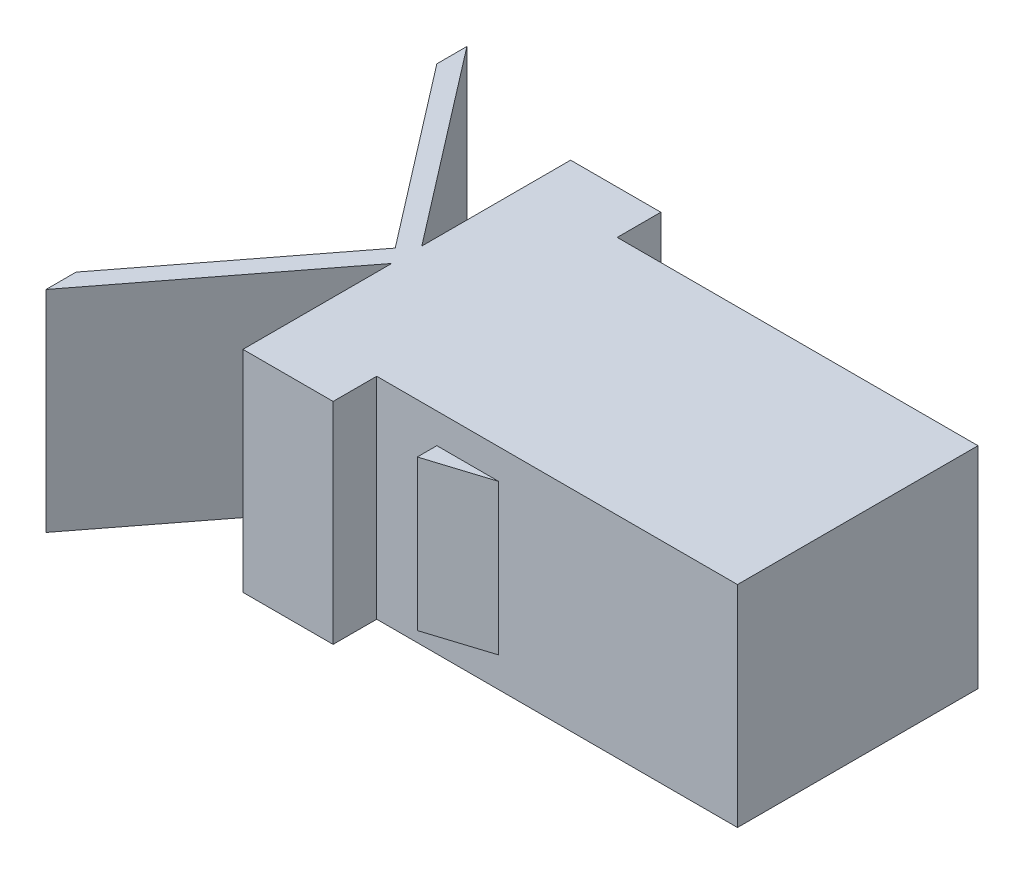
ISO-10303-21;
HEADER;
FILE_DESCRIPTION(('STEP AP214'),'2;1');
FILE_NAME('part.step','',(''),(''),'','','');
FILE_SCHEMA(('AUTOMOTIVE_DESIGN { 1 0 10303 214 1 1 1 1 }'));
ENDSEC;
DATA;
#1=APPLICATION_CONTEXT('core data for automotive mechanical design processes');
#2=APPLICATION_PROTOCOL_DEFINITION('international standard','automotive_design',2000,#1);
#3=PRODUCT_CONTEXT('',#1,'mechanical');
#4=PRODUCT('Part','Part','',(#3));
#5=PRODUCT_RELATED_PRODUCT_CATEGORY('part','',(#4));
#6=PRODUCT_DEFINITION_FORMATION('','',#4);
#7=PRODUCT_DEFINITION_CONTEXT('part definition',#1,'design');
#8=PRODUCT_DEFINITION('design','',#6,#7);
#9=PRODUCT_DEFINITION_SHAPE('','',#8);
#10=(LENGTH_UNIT() NAMED_UNIT(*) SI_UNIT(.MILLI.,.METRE.));
#11=(NAMED_UNIT(*) PLANE_ANGLE_UNIT() SI_UNIT($,.RADIAN.));
#12=(NAMED_UNIT(*) SI_UNIT($,.STERADIAN.) SOLID_ANGLE_UNIT());
#13=UNCERTAINTY_MEASURE_WITH_UNIT(LENGTH_MEASURE(1.E-05),#10,'distance_accuracy_value','');
#14=(GEOMETRIC_REPRESENTATION_CONTEXT(3) GLOBAL_UNCERTAINTY_ASSIGNED_CONTEXT((#13)) GLOBAL_UNIT_ASSIGNED_CONTEXT((#10,
#11,#12)) REPRESENTATION_CONTEXT('',''));
#15=CARTESIAN_POINT('',(0.,0.,0.));
#16=DIRECTION('',(0.,0.,1.));
#17=DIRECTION('',(1.,0.,0.));
#18=AXIS2_PLACEMENT_3D('',#15,#16,#17);
#19=CARTESIAN_POINT('',(-3.,-11.3053084876088,0.));
#20=DIRECTION('',(1.,0.,0.));
#21=DIRECTION('',(0.,0.,-1.));
#22=AXIS2_PLACEMENT_3D('',#19,#20,#21);
#23=PLANE('',#22);
#24=DIRECTION('',(0.,1.,0.));
#25=VECTOR('',#24,1.);
#26=CARTESIAN_POINT('',(-3.,-14.8660687473185,-3.5));
#27=LINE('',#26,#25);
#28=CARTESIAN_POINT('',(-3.,0.,-3.5));
#29=VERTEX_POINT('',#28);
#30=CARTESIAN_POINT('',(-3.,7.,-3.5));
#31=VERTEX_POINT('',#30);
#32=EDGE_CURVE('E303',#29,#31,#27,.T.);
#33=ORIENTED_EDGE('',*,*,#32,.F.);
#34=DIRECTION('',(0.,0.,-1.));
#35=VECTOR('',#34,1.);
#36=CARTESIAN_POINT('',(-3.,0.,0.));
#37=LINE('',#36,#35);
#38=CARTESIAN_POINT('',(-3.,0.,1.45));
#39=VERTEX_POINT('',#38);
#40=EDGE_CURVE('E340',#39,#29,#37,.T.);
#41=ORIENTED_EDGE('',*,*,#40,.F.);
#42=DIRECTION('',(0.,1.,0.));
#43=VECTOR('',#42,1.);
#44=CARTESIAN_POINT('',(-3.,-11.3053084876088,1.45));
#45=LINE('',#44,#43);
#46=CARTESIAN_POINT('',(-3.,7.,1.45));
#47=VERTEX_POINT('',#46);
#48=EDGE_CURVE('E365',#39,#47,#45,.T.);
#49=ORIENTED_EDGE('',*,*,#48,.T.);
#50=DIRECTION('',(0.,0.,-1.));
#51=VECTOR('',#50,1.);
#52=CARTESIAN_POINT('',(-3.,7.,0.));
#53=LINE('',#52,#51);
#54=EDGE_CURVE('E331',#47,#31,#53,.T.);
#55=ORIENTED_EDGE('',*,*,#54,.T.);
#56=EDGE_LOOP('',(#33,#41,#49,#55));
#57=FACE_BOUND('',#56,.T.);
#58=ADVANCED_FACE('F43',(#57),#23,.F.);
#59=CARTESIAN_POINT('',(0.,7.,0.));
#60=DIRECTION('',(0.,0.,-1.));
#61=DIRECTION('',(-1.,0.,0.));
#62=AXIS2_PLACEMENT_3D('',#59,#60,#61);
#63=PLANE('',#62);
#64=DIRECTION('',(-1.,0.,0.));
#65=VECTOR('',#64,1.);
#66=CARTESIAN_POINT('',(4.05807540159878,1.,0.));
#67=LINE('',#66,#65);
#68=CARTESIAN_POINT('',(4.05807540159878,1.,0.));
#69=VERTEX_POINT('',#68);
#70=CARTESIAN_POINT('',(2.,1.,0.));
#71=VERTEX_POINT('',#70);
#72=EDGE_CURVE('E190',#69,#71,#67,.T.);
#73=ORIENTED_EDGE('',*,*,#72,.T.);
#74=DIRECTION('',(0.,1.,0.));
#75=VECTOR('',#74,1.);
#76=CARTESIAN_POINT('',(2.,-2.1582804170603,0.));
#77=LINE('',#76,#75);
#78=CARTESIAN_POINT('',(2.,6.,0.));
#79=VERTEX_POINT('',#78);
#80=EDGE_CURVE('E206',#71,#79,#77,.T.);
#81=ORIENTED_EDGE('',*,*,#80,.T.);
#82=DIRECTION('',(-1.,0.,0.));
#83=VECTOR('',#82,1.);
#84=CARTESIAN_POINT('',(4.05807540159878,6.,0.));
#85=LINE('',#84,#83);
#86=CARTESIAN_POINT('',(4.05807540159878,6.,0.));
#87=VERTEX_POINT('',#86);
#88=EDGE_CURVE('E214',#87,#79,#85,.T.);
#89=ORIENTED_EDGE('',*,*,#88,.F.);
#90=DIRECTION('',(0.,1.,0.));
#91=VECTOR('',#90,1.);
#92=CARTESIAN_POINT('',(4.05807540159878,-2.1582804170603,0.));
#93=LINE('',#92,#91);
#94=EDGE_CURVE('E193',#69,#87,#93,.T.);
#95=ORIENTED_EDGE('',*,*,#94,.F.);
#96=EDGE_LOOP('',(#73,#81,#89,#95));
#97=FACE_BOUND('',#96,.T.);
#98=DIRECTION('',(1.,0.,0.));
#99=VECTOR('',#98,1.);
#100=CARTESIAN_POINT('',(0.,0.,0.));
#101=LINE('',#100,#99);
#102=CARTESIAN_POINT('',(0.,0.,0.));
#103=VERTEX_POINT('',#102);
#104=CARTESIAN_POINT('',(12.,0.,0.));
#105=VERTEX_POINT('',#104);
#106=EDGE_CURVE('E345',#103,#105,#101,.T.);
#107=ORIENTED_EDGE('',*,*,#106,.T.);
#108=DIRECTION('',(0.,-1.,0.));
#109=VECTOR('',#108,1.);
#110=CARTESIAN_POINT('',(12.,7.,0.));
#111=LINE('',#110,#109);
#112=CARTESIAN_POINT('',(12.,7.,0.));
#113=VERTEX_POINT('',#112);
#114=EDGE_CURVE('E52',#113,#105,#111,.T.);
#115=ORIENTED_EDGE('',*,*,#114,.F.);
#116=DIRECTION('',(1.,0.,0.));
#117=VECTOR('',#116,1.);
#118=CARTESIAN_POINT('',(0.,7.,0.));
#119=LINE('',#118,#117);
#120=CARTESIAN_POINT('',(0.,7.,0.));
#121=VERTEX_POINT('',#120);
#122=EDGE_CURVE('E373',#121,#113,#119,.T.);
#123=ORIENTED_EDGE('',*,*,#122,.F.);
#124=DIRECTION('',(0.,-1.,0.));
#125=VECTOR('',#124,1.);
#126=CARTESIAN_POINT('',(0.,7.,0.));
#127=LINE('',#126,#125);
#128=EDGE_CURVE('E12',#121,#103,#127,.T.);
#129=ORIENTED_EDGE('',*,*,#128,.T.);
#130=EDGE_LOOP('',(#107,#115,#123,#129));
#131=FACE_BOUND('',#130,.T.);
#132=ADVANCED_FACE('F45',(#97,#131),#63,.F.);
#133=CARTESIAN_POINT('',(12.,7.,0.));
#134=DIRECTION('',(-1.,0.,0.));
#135=DIRECTION('',(0.,0.,1.));
#136=AXIS2_PLACEMENT_3D('',#133,#134,#135);
#137=PLANE('',#136);
#138=DIRECTION('',(0.,0.,-1.));
#139=VECTOR('',#138,1.);
#140=CARTESIAN_POINT('',(12.,0.,0.));
#141=LINE('',#140,#139);
#142=CARTESIAN_POINT('',(12.,0.,-8.));
#143=VERTEX_POINT('',#142);
#144=EDGE_CURVE('E386',#105,#143,#141,.T.);
#145=ORIENTED_EDGE('',*,*,#144,.T.);
#146=DIRECTION('',(0.,-1.,0.));
#147=VECTOR('',#146,1.);
#148=CARTESIAN_POINT('',(12.,7.,-8.));
#149=LINE('',#148,#147);
#150=CARTESIAN_POINT('',(12.,7.,-8.));
#151=VERTEX_POINT('',#150);
#152=EDGE_CURVE('E394',#151,#143,#149,.T.);
#153=ORIENTED_EDGE('',*,*,#152,.F.);
#154=DIRECTION('',(0.,0.,-1.));
#155=VECTOR('',#154,1.);
#156=CARTESIAN_POINT('',(12.,7.,0.));
#157=LINE('',#156,#155);
#158=EDGE_CURVE('E376',#113,#151,#157,.T.);
#159=ORIENTED_EDGE('',*,*,#158,.F.);
#160=ORIENTED_EDGE('',*,*,#114,.T.);
#161=EDGE_LOOP('',(#145,#153,#159,#160));
#162=FACE_BOUND('',#161,.T.);
#163=ADVANCED_FACE('F403',(#162),#137,.F.);
#164=CARTESIAN_POINT('',(0.,7.,-8.));
#165=DIRECTION('',(0.,0.,1.));
#166=DIRECTION('',(1.,0.,0.));
#167=AXIS2_PLACEMENT_3D('',#164,#165,#166);
#168=PLANE('',#167);
#169=DIRECTION('',(1.,0.,0.));
#170=VECTOR('',#169,1.);
#171=CARTESIAN_POINT('',(2.,1.,-8.));
#172=LINE('',#171,#170);
#173=CARTESIAN_POINT('',(2.,1.,-8.));
#174=VERTEX_POINT('',#173);
#175=CARTESIAN_POINT('',(3.,1.,-8.));
#176=VERTEX_POINT('',#175);
#177=EDGE_CURVE('E239',#174,#176,#172,.T.);
#178=ORIENTED_EDGE('',*,*,#177,.T.);
#179=DIRECTION('',(0.,1.,0.));
#180=VECTOR('',#179,1.);
#181=CARTESIAN_POINT('',(3.,-2.1582804170603,-8.));
#182=LINE('',#181,#180);
#183=CARTESIAN_POINT('',(3.,6.,-8.));
#184=VERTEX_POINT('',#183);
#185=EDGE_CURVE('E243',#176,#184,#182,.T.);
#186=ORIENTED_EDGE('',*,*,#185,.T.);
#187=DIRECTION('',(1.,0.,0.));
#188=VECTOR('',#187,1.);
#189=CARTESIAN_POINT('',(2.,6.,-8.));
#190=LINE('',#189,#188);
#191=CARTESIAN_POINT('',(2.,6.,-8.));
#192=VERTEX_POINT('',#191);
#193=EDGE_CURVE('E222',#192,#184,#190,.T.);
#194=ORIENTED_EDGE('',*,*,#193,.F.);
#195=DIRECTION('',(0.,1.,0.));
#196=VECTOR('',#195,1.);
#197=CARTESIAN_POINT('',(2.,-2.1582804170603,-8.));
#198=LINE('',#197,#196);
#199=EDGE_CURVE('E244',#174,#192,#198,.T.);
#200=ORIENTED_EDGE('',*,*,#199,.F.);
#201=EDGE_LOOP('',(#178,#186,#194,#200));
#202=FACE_BOUND('',#201,.T.);
#203=DIRECTION('',(-1.,0.,0.));
#204=VECTOR('',#203,1.);
#205=CARTESIAN_POINT('',(0.,0.,-8.));
#206=LINE('',#205,#204);
#207=CARTESIAN_POINT('',(0.,0.,-8.));
#208=VERTEX_POINT('',#207);
#209=EDGE_CURVE('E377',#143,#208,#206,.T.);
#210=ORIENTED_EDGE('',*,*,#209,.T.);
#211=DIRECTION('',(0.,-1.,0.));
#212=VECTOR('',#211,1.);
#213=CARTESIAN_POINT('',(0.,7.,-8.));
#214=LINE('',#213,#212);
#215=CARTESIAN_POINT('',(0.,7.,-8.));
#216=VERTEX_POINT('',#215);
#217=EDGE_CURVE('E383',#216,#208,#214,.T.);
#218=ORIENTED_EDGE('',*,*,#217,.F.);
#219=DIRECTION('',(-1.,0.,0.));
#220=VECTOR('',#219,1.);
#221=CARTESIAN_POINT('',(0.,7.,-8.));
#222=LINE('',#221,#220);
#223=EDGE_CURVE('E380',#151,#216,#222,.T.);
#224=ORIENTED_EDGE('',*,*,#223,.F.);
#225=ORIENTED_EDGE('',*,*,#152,.T.);
#226=EDGE_LOOP('',(#210,#218,#224,#225));
#227=FACE_BOUND('',#226,.T.);
#228=ADVANCED_FACE('F412',(#202,#227),#168,.F.);
#229=CARTESIAN_POINT('',(0.,7.,0.));
#230=DIRECTION('',(0.,-1.,0.));
#231=DIRECTION('',(0.,0.,-1.));
#232=AXIS2_PLACEMENT_3D('',#229,#230,#231);
#233=PLANE('',#232);
#234=ORIENTED_EDGE('',*,*,#223,.T.);
#235=DIRECTION('',(0.,0.,1.));
#236=VECTOR('',#235,1.);
#237=CARTESIAN_POINT('',(0.,7.,0.));
#238=LINE('',#237,#236);
#239=CARTESIAN_POINT('',(0.,7.,-9.45));
#240=VERTEX_POINT('',#239);
#241=EDGE_CURVE('E341',#240,#216,#238,.T.);
#242=ORIENTED_EDGE('',*,*,#241,.F.);
#243=DIRECTION('',(-1.,0.,0.));
#244=VECTOR('',#243,1.);
#245=CARTESIAN_POINT('',(0.,7.,-9.45));
#246=LINE('',#245,#244);
#247=CARTESIAN_POINT('',(-3.,7.,-9.45));
#248=VERTEX_POINT('',#247);
#249=EDGE_CURVE('E335',#240,#248,#246,.T.);
#250=ORIENTED_EDGE('',*,*,#249,.T.);
#251=CARTESIAN_POINT('',(-3.,7.,-4.5));
#252=VERTEX_POINT('',#251);
#253=EDGE_CURVE('E334',#252,#248,#53,.T.);
#254=ORIENTED_EDGE('',*,*,#253,.F.);
#255=DIRECTION('',(-0.609710760849693,0.,-0.7926239891046));
#256=VECTOR('',#255,1.);
#257=CARTESIAN_POINT('',(0.289962825278814,7.,-0.223048327137549));
#258=LINE('',#257,#256);
#259=CARTESIAN_POINT('',(-8.00000000000001,7.,-11.));
#260=VERTEX_POINT('',#259);
#261=EDGE_CURVE('E260',#252,#260,#258,.T.);
#262=ORIENTED_EDGE('',*,*,#261,.T.);
#263=DIRECTION('',(0.,0.,1.));
#264=VECTOR('',#263,1.);
#265=CARTESIAN_POINT('',(-8.00000000000001,7.,0.));
#266=LINE('',#265,#264);
#267=CARTESIAN_POINT('',(-8.00000000000001,7.,-10.));
#268=VERTEX_POINT('',#267);
#269=EDGE_CURVE('E255',#260,#268,#266,.T.);
#270=ORIENTED_EDGE('',*,*,#269,.T.);
#271=DIRECTION('',(0.609710760849693,0.,0.7926239891046));
#272=VECTOR('',#271,1.);
#273=CARTESIAN_POINT('',(-0.19330855018587,7.,0.148698884758362));
#274=LINE('',#273,#272);
#275=CARTESIAN_POINT('',(-3.38461538461538,7.,-4.));
#276=VERTEX_POINT('',#275);
#277=EDGE_CURVE('E254',#268,#276,#274,.T.);
#278=ORIENTED_EDGE('',*,*,#277,.T.);
#279=DIRECTION('',(-0.609710760849692,0.,0.7926239891046));
#280=VECTOR('',#279,1.);
#281=CARTESIAN_POINT('',(-4.05947955390335,7.,-3.12267657992565));
#282=LINE('',#281,#280);
#283=CARTESIAN_POINT('',(-8.,7.,2.));
#284=VERTEX_POINT('',#283);
#285=EDGE_CURVE('E272',#276,#284,#282,.T.);
#286=ORIENTED_EDGE('',*,*,#285,.T.);
#287=DIRECTION('',(0.,0.,1.));
#288=VECTOR('',#287,1.);
#289=CARTESIAN_POINT('',(-8.,7.,0.));
#290=LINE('',#289,#288);
#291=CARTESIAN_POINT('',(-8.,7.,3.));
#292=VERTEX_POINT('',#291);
#293=EDGE_CURVE('E268',#284,#292,#290,.T.);
#294=ORIENTED_EDGE('',*,*,#293,.T.);
#295=DIRECTION('',(0.609710760849692,0.,-0.7926239891046));
#296=VECTOR('',#295,1.);
#297=CARTESIAN_POINT('',(-3.57620817843866,7.,-2.75092936802974));
#298=LINE('',#297,#296);
#299=EDGE_CURVE('E264',#292,#31,#298,.T.);
#300=ORIENTED_EDGE('',*,*,#299,.T.);
#301=ORIENTED_EDGE('',*,*,#54,.F.);
#302=DIRECTION('',(-1.,0.,0.));
#303=VECTOR('',#302,1.);
#304=CARTESIAN_POINT('',(0.,7.,1.45));
#305=LINE('',#304,#303);
#306=CARTESIAN_POINT('',(0.,7.,1.45));
#307=VERTEX_POINT('',#306);
#308=EDGE_CURVE('E325',#307,#47,#305,.T.);
#309=ORIENTED_EDGE('',*,*,#308,.F.);
#310=EDGE_CURVE('E346',#121,#307,#238,.T.);
#311=ORIENTED_EDGE('',*,*,#310,.F.);
#312=ORIENTED_EDGE('',*,*,#122,.T.);
#313=ORIENTED_EDGE('',*,*,#158,.T.);
#314=EDGE_LOOP('',(#234,#242,#250,#254,#262,#270,#278,#286,#294,#300,#301,#309,#311,#312,#313));
#315=FACE_BOUND('',#314,.T.);
#316=ADVANCED_FACE('F420',(#315),#233,.F.);
#317=CARTESIAN_POINT('',(0.,0.,0.));
#318=DIRECTION('',(0.,-1.,0.));
#319=DIRECTION('',(0.,0.,-1.));
#320=AXIS2_PLACEMENT_3D('',#317,#318,#319);
#321=PLANE('',#320);
#322=ORIENTED_EDGE('',*,*,#106,.F.);
#323=DIRECTION('',(0.,0.,1.));
#324=VECTOR('',#323,1.);
#325=CARTESIAN_POINT('',(0.,0.,0.));
#326=LINE('',#325,#324);
#327=CARTESIAN_POINT('',(0.,0.,1.45));
#328=VERTEX_POINT('',#327);
#329=EDGE_CURVE('E324',#103,#328,#326,.T.);
#330=ORIENTED_EDGE('',*,*,#329,.T.);
#331=DIRECTION('',(-1.,0.,0.));
#332=VECTOR('',#331,1.);
#333=CARTESIAN_POINT('',(0.,0.,1.45));
#334=LINE('',#333,#332);
#335=EDGE_CURVE('E355',#328,#39,#334,.T.);
#336=ORIENTED_EDGE('',*,*,#335,.T.);
#337=ORIENTED_EDGE('',*,*,#40,.T.);
#338=DIRECTION('',(0.609710760849692,0.,-0.7926239891046));
#339=VECTOR('',#338,1.);
#340=CARTESIAN_POINT('',(-3.57620817843866,0.,-2.75092936802974));
#341=LINE('',#340,#339);
#342=CARTESIAN_POINT('',(-8.,0.,3.));
#343=VERTEX_POINT('',#342);
#344=EDGE_CURVE('E299',#343,#29,#341,.T.);
#345=ORIENTED_EDGE('',*,*,#344,.F.);
#346=DIRECTION('',(0.,0.,1.));
#347=VECTOR('',#346,1.);
#348=CARTESIAN_POINT('',(-8.,0.,0.));
#349=LINE('',#348,#347);
#350=CARTESIAN_POINT('',(-8.,0.,2.));
#351=VERTEX_POINT('',#350);
#352=EDGE_CURVE('E305',#351,#343,#349,.T.);
#353=ORIENTED_EDGE('',*,*,#352,.F.);
#354=DIRECTION('',(-0.609710760849692,0.,0.7926239891046));
#355=VECTOR('',#354,1.);
#356=CARTESIAN_POINT('',(-4.05947955390335,0.,-3.12267657992565));
#357=LINE('',#356,#355);
#358=CARTESIAN_POINT('',(-3.38461538461539,0.,-4.));
#359=VERTEX_POINT('',#358);
#360=EDGE_CURVE('E259',#359,#351,#357,.T.);
#361=ORIENTED_EDGE('',*,*,#360,.F.);
#362=DIRECTION('',(0.609710760849693,0.,0.7926239891046));
#363=VECTOR('',#362,1.);
#364=CARTESIAN_POINT('',(-0.19330855018587,0.,0.148698884758362));
#365=LINE('',#364,#363);
#366=CARTESIAN_POINT('',(-8.00000000000001,0.,-10.));
#367=VERTEX_POINT('',#366);
#368=EDGE_CURVE('E283',#367,#359,#365,.T.);
#369=ORIENTED_EDGE('',*,*,#368,.F.);
#370=DIRECTION('',(0.,0.,1.));
#371=VECTOR('',#370,1.);
#372=CARTESIAN_POINT('',(-8.00000000000001,0.,0.));
#373=LINE('',#372,#371);
#374=CARTESIAN_POINT('',(-8.00000000000001,0.,-11.));
#375=VERTEX_POINT('',#374);
#376=EDGE_CURVE('E289',#375,#367,#373,.T.);
#377=ORIENTED_EDGE('',*,*,#376,.F.);
#378=DIRECTION('',(-0.609710760849693,0.,-0.7926239891046));
#379=VECTOR('',#378,1.);
#380=CARTESIAN_POINT('',(0.289962825278814,0.,-0.223048327137549));
#381=LINE('',#380,#379);
#382=CARTESIAN_POINT('',(-3.,0.,-4.5));
#383=VERTEX_POINT('',#382);
#384=EDGE_CURVE('E294',#383,#375,#381,.T.);
#385=ORIENTED_EDGE('',*,*,#384,.F.);
#386=CARTESIAN_POINT('',(-3.,0.,-9.45));
#387=VERTEX_POINT('',#386);
#388=EDGE_CURVE('E358',#383,#387,#37,.T.);
#389=ORIENTED_EDGE('',*,*,#388,.T.);
#390=DIRECTION('',(-1.,0.,0.));
#391=VECTOR('',#390,1.);
#392=CARTESIAN_POINT('',(0.,0.,-9.45));
#393=LINE('',#392,#391);
#394=CARTESIAN_POINT('',(0.,0.,-9.45));
#395=VERTEX_POINT('',#394);
#396=EDGE_CURVE('E339',#395,#387,#393,.T.);
#397=ORIENTED_EDGE('',*,*,#396,.F.);
#398=EDGE_CURVE('E351',#395,#208,#326,.T.);
#399=ORIENTED_EDGE('',*,*,#398,.T.);
#400=ORIENTED_EDGE('',*,*,#209,.F.);
#401=ORIENTED_EDGE('',*,*,#144,.F.);
#402=EDGE_LOOP('',(#322,#330,#336,#337,#345,#353,#361,#369,#377,#385,#389,#397,#399,#400,#401));
#403=FACE_BOUND('',#402,.T.);
#404=ADVANCED_FACE('F408',(#403),#321,.T.);
#405=CARTESIAN_POINT('',(0.,-11.3053084876088,0.));
#406=DIRECTION('',(-1.,0.,0.));
#407=DIRECTION('',(0.,0.,1.));
#408=AXIS2_PLACEMENT_3D('',#405,#406,#407);
#409=PLANE('',#408);
#410=ORIENTED_EDGE('',*,*,#241,.T.);
#411=ORIENTED_EDGE('',*,*,#217,.T.);
#412=ORIENTED_EDGE('',*,*,#398,.F.);
#413=DIRECTION('',(0.,1.,0.));
#414=VECTOR('',#413,1.);
#415=CARTESIAN_POINT('',(0.,-11.3053084876088,-9.45));
#416=LINE('',#415,#414);
#417=EDGE_CURVE('E329',#395,#240,#416,.T.);
#418=ORIENTED_EDGE('',*,*,#417,.T.);
#419=EDGE_LOOP('',(#410,#411,#412,#418));
#420=FACE_BOUND('',#419,.T.);
#421=ADVANCED_FACE('F415',(#420),#409,.F.);
#422=CARTESIAN_POINT('',(0.,-11.3053084876088,-9.45));
#423=DIRECTION('',(0.,0.,-1.));
#424=DIRECTION('',(-1.,0.,0.));
#425=AXIS2_PLACEMENT_3D('',#422,#423,#424);
#426=PLANE('',#425);
#427=ORIENTED_EDGE('',*,*,#417,.F.);
#428=ORIENTED_EDGE('',*,*,#396,.T.);
#429=DIRECTION('',(0.,1.,0.));
#430=VECTOR('',#429,1.);
#431=CARTESIAN_POINT('',(-3.,-11.3053084876088,-9.45));
#432=LINE('',#431,#430);
#433=EDGE_CURVE('E350',#387,#248,#432,.T.);
#434=ORIENTED_EDGE('',*,*,#433,.T.);
#435=ORIENTED_EDGE('',*,*,#249,.F.);
#436=EDGE_LOOP('',(#427,#428,#434,#435));
#437=FACE_BOUND('',#436,.T.);
#438=ADVANCED_FACE('F423',(#437),#426,.T.);
#439=ORIENTED_EDGE('',*,*,#388,.F.);
#440=DIRECTION('',(0.,1.,0.));
#441=VECTOR('',#440,1.);
#442=CARTESIAN_POINT('',(-3.,-14.8660687473185,-4.5));
#443=LINE('',#442,#441);
#444=EDGE_CURVE('E298',#383,#252,#443,.T.);
#445=ORIENTED_EDGE('',*,*,#444,.T.);
#446=ORIENTED_EDGE('',*,*,#253,.T.);
#447=ORIENTED_EDGE('',*,*,#433,.F.);
#448=EDGE_LOOP('',(#439,#445,#446,#447));
#449=FACE_BOUND('',#448,.T.);
#450=ADVANCED_FACE('F426',(#449),#23,.F.);
#451=CARTESIAN_POINT('',(0.,-11.3053084876088,1.45));
#452=DIRECTION('',(0.,0.,-1.));
#453=DIRECTION('',(-1.,0.,0.));
#454=AXIS2_PLACEMENT_3D('',#451,#452,#453);
#455=PLANE('',#454);
#456=ORIENTED_EDGE('',*,*,#335,.F.);
#457=DIRECTION('',(0.,1.,0.));
#458=VECTOR('',#457,1.);
#459=CARTESIAN_POINT('',(0.,-11.3053084876088,1.45));
#460=LINE('',#459,#458);
#461=EDGE_CURVE('E330',#328,#307,#460,.T.);
#462=ORIENTED_EDGE('',*,*,#461,.T.);
#463=ORIENTED_EDGE('',*,*,#308,.T.);
#464=ORIENTED_EDGE('',*,*,#48,.F.);
#465=EDGE_LOOP('',(#456,#462,#463,#464));
#466=FACE_BOUND('',#465,.T.);
#467=ADVANCED_FACE('F443',(#466),#455,.F.);
#468=ORIENTED_EDGE('',*,*,#128,.F.);
#469=ORIENTED_EDGE('',*,*,#310,.T.);
#470=ORIENTED_EDGE('',*,*,#461,.F.);
#471=ORIENTED_EDGE('',*,*,#329,.F.);
#472=EDGE_LOOP('',(#468,#469,#470,#471));
#473=FACE_BOUND('',#472,.T.);
#474=ADVANCED_FACE('F439',(#473),#409,.F.);
#475=CARTESIAN_POINT('',(-4.05947955390335,-14.8660687473185,-3.12267657992565));
#476=DIRECTION('',(-0.7926239891046,0.,-0.609710760849692));
#477=DIRECTION('',(-0.609710760849692,0.,0.7926239891046));
#478=AXIS2_PLACEMENT_3D('',#475,#476,#477);
#479=PLANE('',#478);
#480=DIRECTION('',(0.,1.,0.));
#481=VECTOR('',#480,1.);
#482=CARTESIAN_POINT('',(-3.38461538461538,-14.8660687473185,-4.));
#483=LINE('',#482,#481);
#484=EDGE_CURVE('E287',#359,#276,#483,.T.);
#485=ORIENTED_EDGE('',*,*,#484,.F.);
#486=ORIENTED_EDGE('',*,*,#360,.T.);
#487=DIRECTION('',(0.,1.,0.));
#488=VECTOR('',#487,1.);
#489=CARTESIAN_POINT('',(-8.,-14.8660687473185,2.));
#490=LINE('',#489,#488);
#491=EDGE_CURVE('E282',#351,#284,#490,.T.);
#492=ORIENTED_EDGE('',*,*,#491,.T.);
#493=ORIENTED_EDGE('',*,*,#285,.F.);
#494=EDGE_LOOP('',(#485,#486,#492,#493));
#495=FACE_BOUND('',#494,.T.);
#496=ADVANCED_FACE('F462',(#495),#479,.T.);
#497=CARTESIAN_POINT('',(-8.,-14.8660687473185,0.));
#498=DIRECTION('',(-1.,0.,0.));
#499=DIRECTION('',(0.,0.,1.));
#500=AXIS2_PLACEMENT_3D('',#497,#498,#499);
#501=PLANE('',#500);
#502=ORIENTED_EDGE('',*,*,#491,.F.);
#503=ORIENTED_EDGE('',*,*,#352,.T.);
#504=DIRECTION('',(0.,1.,0.));
#505=VECTOR('',#504,1.);
#506=CARTESIAN_POINT('',(-8.,-14.8660687473185,3.));
#507=LINE('',#506,#505);
#508=EDGE_CURVE('E304',#343,#292,#507,.T.);
#509=ORIENTED_EDGE('',*,*,#508,.T.);
#510=ORIENTED_EDGE('',*,*,#293,.F.);
#511=EDGE_LOOP('',(#502,#503,#509,#510));
#512=FACE_BOUND('',#511,.T.);
#513=ADVANCED_FACE('F454',(#512),#501,.T.);
#514=CARTESIAN_POINT('',(-3.57620817843866,-14.8660687473185,-2.75092936802974));
#515=DIRECTION('',(0.7926239891046,0.,0.609710760849692));
#516=DIRECTION('',(0.609710760849692,0.,-0.7926239891046));
#517=AXIS2_PLACEMENT_3D('',#514,#515,#516);
#518=PLANE('',#517);
#519=ORIENTED_EDGE('',*,*,#508,.F.);
#520=ORIENTED_EDGE('',*,*,#344,.T.);
#521=ORIENTED_EDGE('',*,*,#32,.T.);
#522=ORIENTED_EDGE('',*,*,#299,.F.);
#523=EDGE_LOOP('',(#519,#520,#521,#522));
#524=FACE_BOUND('',#523,.T.);
#525=ADVANCED_FACE('F449',(#524),#518,.T.);
#526=CARTESIAN_POINT('',(0.289962825278814,-14.8660687473185,-0.223048327137549));
#527=DIRECTION('',(0.7926239891046,0.,-0.609710760849693));
#528=DIRECTION('',(-0.609710760849693,0.,-0.7926239891046));
#529=AXIS2_PLACEMENT_3D('',#526,#527,#528);
#530=PLANE('',#529);
#531=ORIENTED_EDGE('',*,*,#444,.F.);
#532=ORIENTED_EDGE('',*,*,#384,.T.);
#533=DIRECTION('',(0.,1.,0.));
#534=VECTOR('',#533,1.);
#535=CARTESIAN_POINT('',(-8.00000000000001,-14.8660687473185,-11.));
#536=LINE('',#535,#534);
#537=EDGE_CURVE('E293',#375,#260,#536,.T.);
#538=ORIENTED_EDGE('',*,*,#537,.T.);
#539=ORIENTED_EDGE('',*,*,#261,.F.);
#540=EDGE_LOOP('',(#531,#532,#538,#539));
#541=FACE_BOUND('',#540,.T.);
#542=ADVANCED_FACE('F468',(#541),#530,.T.);
#543=CARTESIAN_POINT('',(-8.00000000000001,-14.8660687473185,0.));
#544=DIRECTION('',(-1.,0.,0.));
#545=DIRECTION('',(0.,0.,1.));
#546=AXIS2_PLACEMENT_3D('',#543,#544,#545);
#547=PLANE('',#546);
#548=ORIENTED_EDGE('',*,*,#537,.F.);
#549=ORIENTED_EDGE('',*,*,#376,.T.);
#550=DIRECTION('',(0.,1.,0.));
#551=VECTOR('',#550,1.);
#552=CARTESIAN_POINT('',(-8.00000000000001,-14.8660687473185,-10.));
#553=LINE('',#552,#551);
#554=EDGE_CURVE('E288',#367,#268,#553,.T.);
#555=ORIENTED_EDGE('',*,*,#554,.T.);
#556=ORIENTED_EDGE('',*,*,#269,.F.);
#557=EDGE_LOOP('',(#548,#549,#555,#556));
#558=FACE_BOUND('',#557,.T.);
#559=ADVANCED_FACE('F466',(#558),#547,.T.);
#560=CARTESIAN_POINT('',(-0.19330855018587,-14.8660687473185,0.148698884758362));
#561=DIRECTION('',(-0.7926239891046,0.,0.609710760849693));
#562=DIRECTION('',(0.609710760849693,0.,0.7926239891046));
#563=AXIS2_PLACEMENT_3D('',#560,#561,#562);
#564=PLANE('',#563);
#565=ORIENTED_EDGE('',*,*,#554,.F.);
#566=ORIENTED_EDGE('',*,*,#368,.T.);
#567=ORIENTED_EDGE('',*,*,#484,.T.);
#568=ORIENTED_EDGE('',*,*,#277,.F.);
#569=EDGE_LOOP('',(#565,#566,#567,#568));
#570=FACE_BOUND('',#569,.T.);
#571=ADVANCED_FACE('F459',(#570),#564,.T.);
#572=CARTESIAN_POINT('',(0.,1.,0.));
#573=DIRECTION('',(0.,-1.,0.));
#574=DIRECTION('',(0.,0.,-1.));
#575=AXIS2_PLACEMENT_3D('',#572,#573,#574);
#576=PLANE('',#575);
#577=ORIENTED_EDGE('',*,*,#177,.F.);
#578=DIRECTION('',(0.,0.,1.));
#579=VECTOR('',#578,1.);
#580=CARTESIAN_POINT('',(2.,1.,-8.));
#581=LINE('',#580,#579);
#582=CARTESIAN_POINT('',(2.,1.,-8.65));
#583=VERTEX_POINT('',#582);
#584=EDGE_CURVE('E67',#583,#174,#581,.T.);
#585=ORIENTED_EDGE('',*,*,#584,.F.);
#586=DIRECTION('',(-0.838443616300636,0.,-0.544988350595416));
#587=VECTOR('',#586,1.);
#588=CARTESIAN_POINT('',(2.,1.,-8.65));
#589=LINE('',#588,#587);
#590=EDGE_CURVE('E227',#176,#583,#589,.T.);
#591=ORIENTED_EDGE('',*,*,#590,.F.);
#592=EDGE_LOOP('',(#577,#585,#591));
#593=FACE_BOUND('',#592,.T.);
#594=ADVANCED_FACE('F607',(#593),#576,.T.);
#595=CARTESIAN_POINT('',(0.,6.,0.));
#596=DIRECTION('',(0.,1.,0.));
#597=DIRECTION('',(0.,0.,1.));
#598=AXIS2_PLACEMENT_3D('',#595,#596,#597);
#599=PLANE('',#598);
#600=ORIENTED_EDGE('',*,*,#193,.T.);
#601=DIRECTION('',(-0.838443616300636,0.,-0.544988350595416));
#602=VECTOR('',#601,1.);
#603=CARTESIAN_POINT('',(2.,6.,-8.65));
#604=LINE('',#603,#602);
#605=CARTESIAN_POINT('',(2.,6.,-8.65));
#606=VERTEX_POINT('',#605);
#607=EDGE_CURVE('E228',#184,#606,#604,.T.);
#608=ORIENTED_EDGE('',*,*,#607,.T.);
#609=DIRECTION('',(0.,0.,1.));
#610=VECTOR('',#609,1.);
#611=CARTESIAN_POINT('',(2.,6.,-8.));
#612=LINE('',#611,#610);
#613=EDGE_CURVE('E223',#606,#192,#612,.T.);
#614=ORIENTED_EDGE('',*,*,#613,.T.);
#615=EDGE_LOOP('',(#600,#608,#614));
#616=FACE_BOUND('',#615,.T.);
#617=ADVANCED_FACE('F614',(#616),#599,.T.);
#618=CARTESIAN_POINT('',(2.,-2.1582804170603,-8.65));
#619=DIRECTION('',(0.544988350595416,0.,-0.838443616300636));
#620=DIRECTION('',(-0.838443616300636,0.,-0.544988350595416));
#621=AXIS2_PLACEMENT_3D('',#618,#619,#620);
#622=PLANE('',#621);
#623=ORIENTED_EDGE('',*,*,#185,.F.);
#624=ORIENTED_EDGE('',*,*,#590,.T.);
#625=DIRECTION('',(0.,1.,0.));
#626=VECTOR('',#625,1.);
#627=CARTESIAN_POINT('',(2.,-2.1582804170603,-8.65));
#628=LINE('',#627,#626);
#629=EDGE_CURVE('E238',#583,#606,#628,.T.);
#630=ORIENTED_EDGE('',*,*,#629,.T.);
#631=ORIENTED_EDGE('',*,*,#607,.F.);
#632=EDGE_LOOP('',(#623,#624,#630,#631));
#633=FACE_BOUND('',#632,.T.);
#634=ADVANCED_FACE('F623',(#633),#622,.T.);
#635=CARTESIAN_POINT('',(2.,-2.1582804170603,-8.));
#636=DIRECTION('',(-1.,0.,0.));
#637=DIRECTION('',(0.,0.,1.));
#638=AXIS2_PLACEMENT_3D('',#635,#636,#637);
#639=PLANE('',#638);
#640=ORIENTED_EDGE('',*,*,#629,.F.);
#641=ORIENTED_EDGE('',*,*,#584,.T.);
#642=ORIENTED_EDGE('',*,*,#199,.T.);
#643=ORIENTED_EDGE('',*,*,#613,.F.);
#644=EDGE_LOOP('',(#640,#641,#642,#643));
#645=FACE_BOUND('',#644,.T.);
#646=ADVANCED_FACE('F632',(#645),#639,.T.);
#647=CARTESIAN_POINT('',(0.,1.,0.));
#648=DIRECTION('',(0.,-1.,0.));
#649=DIRECTION('',(0.,0.,-1.));
#650=AXIS2_PLACEMENT_3D('',#647,#648,#649);
#651=PLANE('',#650);
#652=ORIENTED_EDGE('',*,*,#72,.F.);
#653=DIRECTION('',(0.953571827520909,0.,-0.301165684895263));
#654=VECTOR('',#653,1.);
#655=CARTESIAN_POINT('',(2.,1.,0.65));
#656=LINE('',#655,#654);
#657=CARTESIAN_POINT('',(2.,1.,0.65));
#658=VERTEX_POINT('',#657);
#659=EDGE_CURVE('E59',#658,#69,#656,.T.);
#660=ORIENTED_EDGE('',*,*,#659,.F.);
#661=DIRECTION('',(0.,0.,1.));
#662=VECTOR('',#661,1.);
#663=CARTESIAN_POINT('',(2.,1.,0.));
#664=LINE('',#663,#662);
#665=EDGE_CURVE('E187',#71,#658,#664,.T.);
#666=ORIENTED_EDGE('',*,*,#665,.F.);
#667=EDGE_LOOP('',(#652,#660,#666));
#668=FACE_BOUND('',#667,.T.);
#669=ADVANCED_FACE('F185',(#668),#651,.T.);
#670=CARTESIAN_POINT('',(0.,6.,0.));
#671=DIRECTION('',(0.,1.,0.));
#672=DIRECTION('',(0.,0.,1.));
#673=AXIS2_PLACEMENT_3D('',#670,#671,#672);
#674=PLANE('',#673);
#675=ORIENTED_EDGE('',*,*,#88,.T.);
#676=DIRECTION('',(0.,0.,1.));
#677=VECTOR('',#676,1.);
#678=CARTESIAN_POINT('',(2.,6.,0.));
#679=LINE('',#678,#677);
#680=CARTESIAN_POINT('',(2.,6.,0.65));
#681=VERTEX_POINT('',#680);
#682=EDGE_CURVE('E210',#79,#681,#679,.T.);
#683=ORIENTED_EDGE('',*,*,#682,.T.);
#684=DIRECTION('',(0.953571827520909,0.,-0.301165684895263));
#685=VECTOR('',#684,1.);
#686=CARTESIAN_POINT('',(2.,6.,0.65));
#687=LINE('',#686,#685);
#688=EDGE_CURVE('E199',#681,#87,#687,.T.);
#689=ORIENTED_EDGE('',*,*,#688,.T.);
#690=EDGE_LOOP('',(#675,#683,#689));
#691=FACE_BOUND('',#690,.T.);
#692=ADVANCED_FACE('F648',(#691),#674,.T.);
#693=CARTESIAN_POINT('',(2.,-2.1582804170603,0.));
#694=DIRECTION('',(-1.,0.,0.));
#695=DIRECTION('',(0.,0.,1.));
#696=AXIS2_PLACEMENT_3D('',#693,#694,#695);
#697=PLANE('',#696);
#698=ORIENTED_EDGE('',*,*,#80,.F.);
#699=ORIENTED_EDGE('',*,*,#665,.T.);
#700=DIRECTION('',(0.,1.,0.));
#701=VECTOR('',#700,1.);
#702=CARTESIAN_POINT('',(2.,-2.1582804170603,0.65));
#703=LINE('',#702,#701);
#704=EDGE_CURVE('E194',#658,#681,#703,.T.);
#705=ORIENTED_EDGE('',*,*,#704,.T.);
#706=ORIENTED_EDGE('',*,*,#682,.F.);
#707=EDGE_LOOP('',(#698,#699,#705,#706));
#708=FACE_BOUND('',#707,.T.);
#709=ADVANCED_FACE('F204',(#708),#697,.T.);
#710=CARTESIAN_POINT('',(2.,-2.1582804170603,0.65));
#711=DIRECTION('',(0.301165684895263,0.,0.953571827520909));
#712=DIRECTION('',(0.953571827520909,0.,-0.301165684895263));
#713=AXIS2_PLACEMENT_3D('',#710,#711,#712);
#714=PLANE('',#713);
#715=ORIENTED_EDGE('',*,*,#704,.F.);
#716=ORIENTED_EDGE('',*,*,#659,.T.);
#717=ORIENTED_EDGE('',*,*,#94,.T.);
#718=ORIENTED_EDGE('',*,*,#688,.F.);
#719=EDGE_LOOP('',(#715,#716,#717,#718));
#720=FACE_BOUND('',#719,.T.);
#721=ADVANCED_FACE('F197',(#720),#714,.T.);
#722=CLOSED_SHELL('',(#58,#132,#163,#228,#316,#404,#421,#438,#450,#467,#474,#496,#513,#525,#542,
#559,#571,#594,#617,#634,#646,#669,#692,#709,#721));
#723=MANIFOLD_SOLID_BREP('B2',#722);
#724=ADVANCED_BREP_SHAPE_REPRESENTATION('',(#18,#723),#14);
#725=SHAPE_DEFINITION_REPRESENTATION(#9,#724);
ENDSEC;
END-ISO-10303-21;
